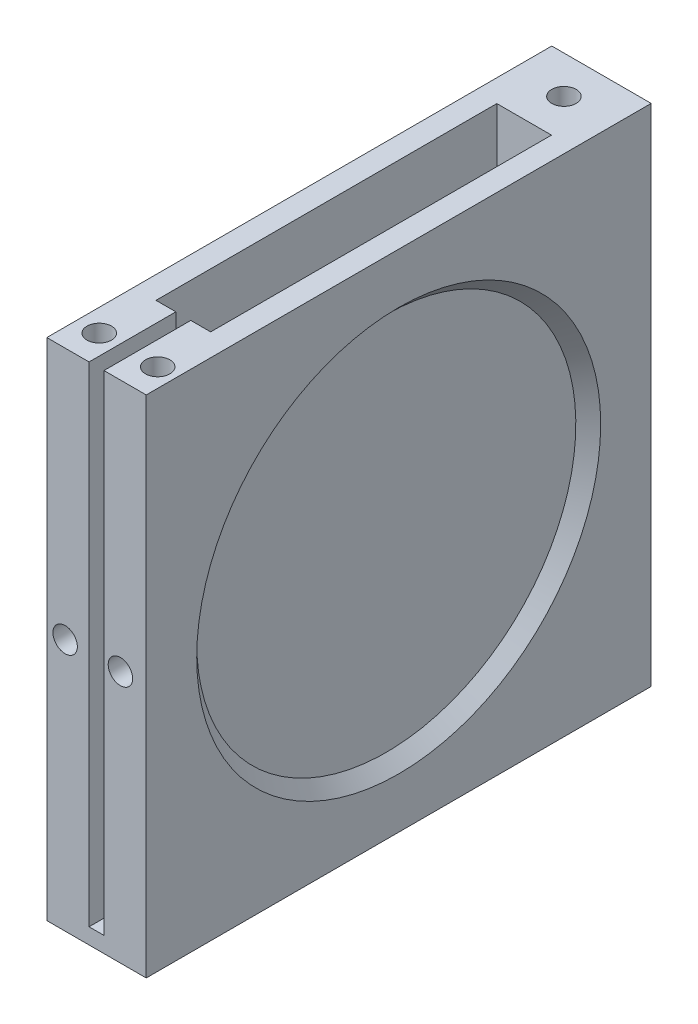
ISO-10303-21;
HEADER;
FILE_DESCRIPTION(('STEP AP214'),'2;1');
FILE_NAME('part.step','',(''),(''),'','','');
FILE_SCHEMA(('AUTOMOTIVE_DESIGN { 1 0 10303 214 1 1 1 1 }'));
ENDSEC;
DATA;
#1=APPLICATION_CONTEXT('core data for automotive mechanical design processes');
#2=APPLICATION_PROTOCOL_DEFINITION('international standard','automotive_design',2000,#1);
#3=PRODUCT_CONTEXT('',#1,'mechanical');
#4=PRODUCT('Part','Part','',(#3));
#5=PRODUCT_RELATED_PRODUCT_CATEGORY('part','',(#4));
#6=PRODUCT_DEFINITION_FORMATION('','',#4);
#7=PRODUCT_DEFINITION_CONTEXT('part definition',#1,'design');
#8=PRODUCT_DEFINITION('design','',#6,#7);
#9=PRODUCT_DEFINITION_SHAPE('','',#8);
#10=(LENGTH_UNIT() NAMED_UNIT(*) SI_UNIT(.MILLI.,.METRE.));
#11=(NAMED_UNIT(*) PLANE_ANGLE_UNIT() SI_UNIT($,.RADIAN.));
#12=(NAMED_UNIT(*) SI_UNIT($,.STERADIAN.) SOLID_ANGLE_UNIT());
#13=UNCERTAINTY_MEASURE_WITH_UNIT(LENGTH_MEASURE(1.E-05),#10,'distance_accuracy_value','');
#14=(GEOMETRIC_REPRESENTATION_CONTEXT(3) GLOBAL_UNCERTAINTY_ASSIGNED_CONTEXT((#13)) GLOBAL_UNIT_ASSIGNED_CONTEXT((#10,
#11,#12)) REPRESENTATION_CONTEXT('',''));
#15=CARTESIAN_POINT('',(0.,0.,0.));
#16=DIRECTION('',(0.,0.,1.));
#17=DIRECTION('',(1.,0.,0.));
#18=AXIS2_PLACEMENT_3D('',#15,#16,#17);
#19=CARTESIAN_POINT('',(0.,0.,-101.6));
#20=DIRECTION('',(0.,0.,1.));
#21=DIRECTION('',(1.,0.,0.));
#22=AXIS2_PLACEMENT_3D('',#19,#20,#21);
#23=PLANE('',#22);
#24=CARTESIAN_POINT('',(-6.10330225330225,0.,-101.6));
#25=DIRECTION('',(0.,0.,-1.));
#26=DIRECTION('',(-1.,0.,0.));
#27=AXIS2_PLACEMENT_3D('',#24,#25,#26);
#28=CIRCLE('',#27,2.45744999999999);
#29=CARTESIAN_POINT('',(-8.56075225330224,0.,-101.6));
#30=VERTEX_POINT('',#29);
#31=EDGE_CURVE('E155',#30,#30,#28,.T.);
#32=ORIENTED_EDGE('',*,*,#31,.F.);
#33=EDGE_LOOP('',(#32));
#34=FACE_BOUND('',#33,.T.);
#35=DIRECTION('',(0.,-1.,0.));
#36=VECTOR('',#35,1.);
#37=CARTESIAN_POINT('',(-10.,50.8,-101.6));
#38=LINE('',#37,#36);
#39=CARTESIAN_POINT('',(-10.,50.8,-101.6));
#40=VERTEX_POINT('',#39);
#41=CARTESIAN_POINT('',(-9.99999999999999,-50.8,-101.6));
#42=VERTEX_POINT('',#41);
#43=EDGE_CURVE('E267',#40,#42,#38,.T.);
#44=ORIENTED_EDGE('',*,*,#43,.F.);
#45=DIRECTION('',(-1.,0.,0.));
#46=VECTOR('',#45,1.);
#47=CARTESIAN_POINT('',(-10.,50.8,-101.6));
#48=LINE('',#47,#46);
#49=CARTESIAN_POINT('',(9.99999999999999,50.8,-101.6));
#50=VERTEX_POINT('',#49);
#51=EDGE_CURVE('E277',#50,#40,#48,.T.);
#52=ORIENTED_EDGE('',*,*,#51,.F.);
#53=DIRECTION('',(0.,1.,0.));
#54=VECTOR('',#53,1.);
#55=CARTESIAN_POINT('',(9.99999999999999,50.8,-101.6));
#56=LINE('',#55,#54);
#57=CARTESIAN_POINT('',(10.,-50.8,-101.6));
#58=VERTEX_POINT('',#57);
#59=EDGE_CURVE('E274',#58,#50,#56,.T.);
#60=ORIENTED_EDGE('',*,*,#59,.F.);
#61=DIRECTION('',(1.,0.,0.));
#62=VECTOR('',#61,1.);
#63=CARTESIAN_POINT('',(-9.99999999999999,-50.8,-101.6));
#64=LINE('',#63,#62);
#65=EDGE_CURVE('E270',#42,#58,#64,.T.);
#66=ORIENTED_EDGE('',*,*,#65,.F.);
#67=EDGE_LOOP('',(#44,#52,#60,#66));
#68=FACE_BOUND('',#67,.T.);
#69=CARTESIAN_POINT('',(0.,0.,-101.6));
#70=DIRECTION('',(0.,0.,-1.));
#71=DIRECTION('',(-1.,0.,0.));
#72=AXIS2_PLACEMENT_3D('',#69,#70,#71);
#73=CIRCLE('',#72,1.5);
#74=CARTESIAN_POINT('',(-1.5,0.,-101.6));
#75=VERTEX_POINT('',#74);
#76=EDGE_CURVE('E177',#75,#75,#73,.T.);
#77=ORIENTED_EDGE('',*,*,#76,.F.);
#78=EDGE_LOOP('',(#77));
#79=FACE_BOUND('',#78,.T.);
#80=CARTESIAN_POINT('',(5.06884424426798,0.,-101.6));
#81=DIRECTION('',(0.,0.,-1.));
#82=DIRECTION('',(-1.,0.,0.));
#83=AXIS2_PLACEMENT_3D('',#80,#81,#82);
#84=CIRCLE('',#83,2.45744999999999);
#85=CARTESIAN_POINT('',(2.61139424426799,0.,-101.6));
#86=VERTEX_POINT('',#85);
#87=EDGE_CURVE('E154',#86,#86,#84,.T.);
#88=ORIENTED_EDGE('',*,*,#87,.F.);
#89=EDGE_LOOP('',(#88));
#90=FACE_BOUND('',#89,.T.);
#91=ADVANCED_FACE('F34',(#34,#68,#79,#90),#23,.F.);
#92=CARTESIAN_POINT('',(-5.5,-47.625,-17.4625));
#93=DIRECTION('',(0.,0.,1.));
#94=DIRECTION('',(1.,0.,0.));
#95=AXIS2_PLACEMENT_3D('',#92,#93,#94);
#96=PLANE('',#95);
#97=DIRECTION('',(1.,0.,0.));
#98=VECTOR('',#97,1.);
#99=CARTESIAN_POINT('',(-5.5,-47.625,-17.4625));
#100=LINE('',#99,#98);
#101=CARTESIAN_POINT('',(1.50000000000001,-47.625,-17.4625));
#102=VERTEX_POINT('',#101);
#103=CARTESIAN_POINT('',(5.5,-47.625,-17.4625));
#104=VERTEX_POINT('',#103);
#105=EDGE_CURVE('E236',#102,#104,#100,.T.);
#106=ORIENTED_EDGE('',*,*,#105,.F.);
#107=DIRECTION('',(0.,-1.,0.));
#108=VECTOR('',#107,1.);
#109=CARTESIAN_POINT('',(1.49999999999999,50.8,-17.4625));
#110=LINE('',#109,#108);
#111=CARTESIAN_POINT('',(1.49999999999999,50.8,-17.4625));
#112=VERTEX_POINT('',#111);
#113=EDGE_CURVE('E51',#112,#102,#110,.T.);
#114=ORIENTED_EDGE('',*,*,#113,.F.);
#115=DIRECTION('',(1.,0.,0.));
#116=VECTOR('',#115,1.);
#117=CARTESIAN_POINT('',(-5.5,50.8,-17.4625));
#118=LINE('',#117,#116);
#119=CARTESIAN_POINT('',(5.5,50.8,-17.4625));
#120=VERTEX_POINT('',#119);
#121=EDGE_CURVE('E249',#112,#120,#118,.T.);
#122=ORIENTED_EDGE('',*,*,#121,.T.);
#123=DIRECTION('',(0.,1.,0.));
#124=VECTOR('',#123,1.);
#125=CARTESIAN_POINT('',(5.5,-47.625,-17.4625));
#126=LINE('',#125,#124);
#127=EDGE_CURVE('E263',#104,#120,#126,.T.);
#128=ORIENTED_EDGE('',*,*,#127,.F.);
#129=EDGE_LOOP('',(#106,#114,#122,#128));
#130=FACE_BOUND('',#129,.T.);
#131=ADVANCED_FACE('F321',(#130),#96,.F.);
#132=CARTESIAN_POINT('',(-10.,50.8,-101.6));
#133=DIRECTION('',(-1.,0.,0.));
#134=DIRECTION('',(0.,-1.,0.));
#135=AXIS2_PLACEMENT_3D('',#132,#133,#134);
#136=PLANE('',#135);
#137=CARTESIAN_POINT('',(-10.,0.,-50.8));
#138=DIRECTION('',(-1.,0.,0.));
#139=DIRECTION('',(0.,-1.,0.));
#140=AXIS2_PLACEMENT_3D('',#137,#138,#139);
#141=CIRCLE('',#140,40.64);
#142=CARTESIAN_POINT('',(-9.99999999999999,-40.64,-50.8));
#143=VERTEX_POINT('',#142);
#144=EDGE_CURVE('E201',#143,#143,#141,.T.);
#145=ORIENTED_EDGE('',*,*,#144,.F.);
#146=EDGE_LOOP('',(#145));
#147=FACE_BOUND('',#146,.T.);
#148=DIRECTION('',(0.,-1.,0.));
#149=VECTOR('',#148,1.);
#150=CARTESIAN_POINT('',(-10.,50.8,0.));
#151=LINE('',#150,#149);
#152=CARTESIAN_POINT('',(-10.,50.8,0.));
#153=VERTEX_POINT('',#152);
#154=CARTESIAN_POINT('',(-9.99999999999999,-50.8,0.));
#155=VERTEX_POINT('',#154);
#156=EDGE_CURVE('E260',#153,#155,#151,.T.);
#157=ORIENTED_EDGE('',*,*,#156,.F.);
#158=DIRECTION('',(0.,0.,1.));
#159=VECTOR('',#158,1.);
#160=CARTESIAN_POINT('',(-10.,50.8,-101.6));
#161=LINE('',#160,#159);
#162=EDGE_CURVE('E11',#40,#153,#161,.T.);
#163=ORIENTED_EDGE('',*,*,#162,.F.);
#164=ORIENTED_EDGE('',*,*,#43,.T.);
#165=DIRECTION('',(0.,0.,1.));
#166=VECTOR('',#165,1.);
#167=CARTESIAN_POINT('',(-9.99999999999999,-50.8,-101.6));
#168=LINE('',#167,#166);
#169=EDGE_CURVE('E38',#42,#155,#168,.T.);
#170=ORIENTED_EDGE('',*,*,#169,.T.);
#171=EDGE_LOOP('',(#157,#163,#164,#170));
#172=FACE_BOUND('',#171,.T.);
#173=ADVANCED_FACE('F36',(#147,#172),#136,.T.);
#174=CARTESIAN_POINT('',(-10.,50.8,-101.6));
#175=DIRECTION('',(0.,1.,0.));
#176=DIRECTION('',(0.,0.,1.));
#177=AXIS2_PLACEMENT_3D('',#174,#175,#176);
#178=PLANE('',#177);
#179=CARTESIAN_POINT('',(-5.49438852834783,50.8,-6.04680271226243));
#180=DIRECTION('',(0.,1.,0.));
#181=DIRECTION('',(0.,0.,1.));
#182=AXIS2_PLACEMENT_3D('',#179,#180,#181);
#183=CIRCLE('',#182,2.45744999999999);
#184=CARTESIAN_POINT('',(-5.49438852834783,50.8,-3.58935271226244));
#185=VERTEX_POINT('',#184);
#186=EDGE_CURVE('E183',#185,#185,#183,.T.);
#187=ORIENTED_EDGE('',*,*,#186,.F.);
#188=EDGE_LOOP('',(#187));
#189=FACE_BOUND('',#188,.T.);
#190=CARTESIAN_POINT('',(6.2626561474417,50.8,-6.04680271226243));
#191=DIRECTION('',(0.,1.,0.));
#192=DIRECTION('',(0.,0.,1.));
#193=AXIS2_PLACEMENT_3D('',#190,#191,#192);
#194=CIRCLE('',#193,2.45744999999999);
#195=CARTESIAN_POINT('',(6.2626561474417,50.8,-3.58935271226244));
#196=VERTEX_POINT('',#195);
#197=EDGE_CURVE('E189',#196,#196,#194,.T.);
#198=ORIENTED_EDGE('',*,*,#197,.F.);
#199=EDGE_LOOP('',(#198));
#200=FACE_BOUND('',#199,.T.);
#201=CARTESIAN_POINT('',(0.,50.8,-94.0389562725272));
#202=DIRECTION('',(0.,1.,0.));
#203=DIRECTION('',(0.,0.,1.));
#204=AXIS2_PLACEMENT_3D('',#201,#202,#203);
#205=CIRCLE('',#204,2.45744999999999);
#206=CARTESIAN_POINT('',(0.,50.8,-91.5815062725272));
#207=VERTEX_POINT('',#206);
#208=EDGE_CURVE('E195',#207,#207,#205,.T.);
#209=ORIENTED_EDGE('',*,*,#208,.F.);
#210=EDGE_LOOP('',(#209));
#211=FACE_BOUND('',#210,.T.);
#212=DIRECTION('',(0.,0.,1.));
#213=VECTOR('',#212,1.);
#214=CARTESIAN_POINT('',(1.49999999999999,50.8,-101.601));
#215=LINE('',#214,#213);
#216=CARTESIAN_POINT('',(1.49999999999999,50.8,0.));
#217=VERTEX_POINT('',#216);
#218=EDGE_CURVE('E228',#112,#217,#215,.T.);
#219=ORIENTED_EDGE('',*,*,#218,.T.);
#220=DIRECTION('',(-1.,0.,0.));
#221=VECTOR('',#220,1.);
#222=CARTESIAN_POINT('',(-10.,50.8,0.));
#223=LINE('',#222,#221);
#224=CARTESIAN_POINT('',(9.99999999999999,50.8,0.));
#225=VERTEX_POINT('',#224);
#226=EDGE_CURVE('E271',#225,#217,#223,.T.);
#227=ORIENTED_EDGE('',*,*,#226,.F.);
#228=DIRECTION('',(0.,0.,1.));
#229=VECTOR('',#228,1.);
#230=CARTESIAN_POINT('',(9.99999999999999,50.8,-101.6));
#231=LINE('',#230,#229);
#232=EDGE_CURVE('E43',#50,#225,#231,.T.);
#233=ORIENTED_EDGE('',*,*,#232,.F.);
#234=ORIENTED_EDGE('',*,*,#51,.T.);
#235=ORIENTED_EDGE('',*,*,#162,.T.);
#236=CARTESIAN_POINT('',(-1.50000000000001,50.8,0.));
#237=VERTEX_POINT('',#236);
#238=EDGE_CURVE('E288',#237,#153,#223,.T.);
#239=ORIENTED_EDGE('',*,*,#238,.F.);
#240=DIRECTION('',(0.,0.,1.));
#241=VECTOR('',#240,1.);
#242=CARTESIAN_POINT('',(-1.50000000000001,50.8,-101.601));
#243=LINE('',#242,#241);
#244=CARTESIAN_POINT('',(-1.50000000000001,50.8,-17.4625));
#245=VERTEX_POINT('',#244);
#246=EDGE_CURVE('E225',#245,#237,#243,.T.);
#247=ORIENTED_EDGE('',*,*,#246,.F.);
#248=CARTESIAN_POINT('',(-5.5,50.8,-17.4625));
#249=VERTEX_POINT('',#248);
#250=EDGE_CURVE('E250',#249,#245,#118,.T.);
#251=ORIENTED_EDGE('',*,*,#250,.F.);
#252=DIRECTION('',(0.,0.,1.));
#253=VECTOR('',#252,1.);
#254=CARTESIAN_POINT('',(-5.50000000000001,50.8,-86.0425));
#255=LINE('',#254,#253);
#256=CARTESIAN_POINT('',(-5.50000000000001,50.8,-86.0425));
#257=VERTEX_POINT('',#256);
#258=EDGE_CURVE('E59',#257,#249,#255,.T.);
#259=ORIENTED_EDGE('',*,*,#258,.F.);
#260=DIRECTION('',(-1.,0.,0.));
#261=VECTOR('',#260,1.);
#262=CARTESIAN_POINT('',(-5.50000000000001,50.8,-86.0425));
#263=LINE('',#262,#261);
#264=CARTESIAN_POINT('',(5.49999999999999,50.8,-86.0425));
#265=VERTEX_POINT('',#264);
#266=EDGE_CURVE('E237',#265,#257,#263,.T.);
#267=ORIENTED_EDGE('',*,*,#266,.F.);
#268=DIRECTION('',(0.,0.,-1.));
#269=VECTOR('',#268,1.);
#270=CARTESIAN_POINT('',(5.49999999999999,50.8,-86.0425));
#271=LINE('',#270,#269);
#272=EDGE_CURVE('E253',#120,#265,#271,.T.);
#273=ORIENTED_EDGE('',*,*,#272,.F.);
#274=ORIENTED_EDGE('',*,*,#121,.F.);
#275=EDGE_LOOP('',(#219,#227,#233,#234,#235,#239,#247,#251,#259,#267,#273,#274));
#276=FACE_BOUND('',#275,.T.);
#277=ADVANCED_FACE('F308',(#189,#200,#211,#276),#178,.T.);
#278=CARTESIAN_POINT('',(9.99999999999999,50.8,-101.6));
#279=DIRECTION('',(1.,0.,0.));
#280=DIRECTION('',(0.,1.,0.));
#281=AXIS2_PLACEMENT_3D('',#278,#279,#280);
#282=PLANE('',#281);
#283=CARTESIAN_POINT('',(10.,0.,-50.8));
#284=DIRECTION('',(1.,0.,0.));
#285=DIRECTION('',(0.,1.,0.));
#286=AXIS2_PLACEMENT_3D('',#283,#284,#285);
#287=CIRCLE('',#286,40.64);
#288=CARTESIAN_POINT('',(9.99999999999999,40.64,-50.8));
#289=VERTEX_POINT('',#288);
#290=EDGE_CURVE('E207',#289,#289,#287,.T.);
#291=ORIENTED_EDGE('',*,*,#290,.F.);
#292=EDGE_LOOP('',(#291));
#293=FACE_BOUND('',#292,.T.);
#294=DIRECTION('',(0.,1.,0.));
#295=VECTOR('',#294,1.);
#296=CARTESIAN_POINT('',(9.99999999999999,50.8,0.));
#297=LINE('',#296,#295);
#298=CARTESIAN_POINT('',(10.,-50.8,0.));
#299=VERTEX_POINT('',#298);
#300=EDGE_CURVE('E285',#299,#225,#297,.T.);
#301=ORIENTED_EDGE('',*,*,#300,.F.);
#302=DIRECTION('',(0.,0.,1.));
#303=VECTOR('',#302,1.);
#304=CARTESIAN_POINT('',(10.,-50.8,-101.6));
#305=LINE('',#304,#303);
#306=EDGE_CURVE('E291',#58,#299,#305,.T.);
#307=ORIENTED_EDGE('',*,*,#306,.F.);
#308=ORIENTED_EDGE('',*,*,#59,.T.);
#309=ORIENTED_EDGE('',*,*,#232,.T.);
#310=EDGE_LOOP('',(#301,#307,#308,#309));
#311=FACE_BOUND('',#310,.T.);
#312=ADVANCED_FACE('F314',(#293,#311),#282,.T.);
#313=CARTESIAN_POINT('',(-9.99999999999999,-50.8,-101.6));
#314=DIRECTION('',(0.,-1.,0.));
#315=DIRECTION('',(0.,0.,-1.));
#316=AXIS2_PLACEMENT_3D('',#313,#314,#315);
#317=PLANE('',#316);
#318=DIRECTION('',(1.,0.,0.));
#319=VECTOR('',#318,1.);
#320=CARTESIAN_POINT('',(-9.99999999999999,-50.8,0.));
#321=LINE('',#320,#319);
#322=EDGE_CURVE('E282',#155,#299,#321,.T.);
#323=ORIENTED_EDGE('',*,*,#322,.F.);
#324=ORIENTED_EDGE('',*,*,#169,.F.);
#325=ORIENTED_EDGE('',*,*,#65,.T.);
#326=ORIENTED_EDGE('',*,*,#306,.T.);
#327=EDGE_LOOP('',(#323,#324,#325,#326));
#328=FACE_BOUND('',#327,.T.);
#329=ADVANCED_FACE('F299',(#328),#317,.T.);
#330=CARTESIAN_POINT('',(0.,0.,0.));
#331=DIRECTION('',(0.,0.,1.));
#332=DIRECTION('',(1.,0.,0.));
#333=AXIS2_PLACEMENT_3D('',#330,#331,#332);
#334=PLANE('',#333);
#335=CARTESIAN_POINT('',(4.80953422007246,0.,0.));
#336=DIRECTION('',(0.,0.,1.));
#337=DIRECTION('',(1.,0.,0.));
#338=AXIS2_PLACEMENT_3D('',#335,#336,#337);
#339=CIRCLE('',#338,2.45745);
#340=CARTESIAN_POINT('',(7.26698422007246,0.,0.));
#341=VERTEX_POINT('',#340);
#342=EDGE_CURVE('E165',#341,#341,#339,.T.);
#343=ORIENTED_EDGE('',*,*,#342,.F.);
#344=EDGE_LOOP('',(#343));
#345=FACE_BOUND('',#344,.T.);
#346=CARTESIAN_POINT('',(-6.31259824089625,0.,0.));
#347=DIRECTION('',(0.,0.,1.));
#348=DIRECTION('',(1.,0.,0.));
#349=AXIS2_PLACEMENT_3D('',#346,#347,#348);
#350=CIRCLE('',#349,2.45745);
#351=CARTESIAN_POINT('',(-3.85514824089625,0.,0.));
#352=VERTEX_POINT('',#351);
#353=EDGE_CURVE('E171',#352,#352,#350,.T.);
#354=ORIENTED_EDGE('',*,*,#353,.F.);
#355=EDGE_LOOP('',(#354));
#356=FACE_BOUND('',#355,.T.);
#357=DIRECTION('',(0.,1.,0.));
#358=VECTOR('',#357,1.);
#359=CARTESIAN_POINT('',(1.49999999999999,50.8,0.));
#360=LINE('',#359,#358);
#361=CARTESIAN_POINT('',(1.50000000000001,-47.625,0.));
#362=VERTEX_POINT('',#361);
#363=EDGE_CURVE('E214',#362,#217,#360,.T.);
#364=ORIENTED_EDGE('',*,*,#363,.F.);
#365=DIRECTION('',(1.,0.,0.));
#366=VECTOR('',#365,1.);
#367=CARTESIAN_POINT('',(-1.49999999999999,-47.625,0.));
#368=LINE('',#367,#366);
#369=CARTESIAN_POINT('',(-1.49999999999999,-47.625,0.));
#370=VERTEX_POINT('',#369);
#371=EDGE_CURVE('E217',#370,#362,#368,.T.);
#372=ORIENTED_EDGE('',*,*,#371,.F.);
#373=DIRECTION('',(0.,-1.,0.));
#374=VECTOR('',#373,1.);
#375=CARTESIAN_POINT('',(-1.50000000000001,50.8,0.));
#376=LINE('',#375,#374);
#377=EDGE_CURVE('E220',#237,#370,#376,.T.);
#378=ORIENTED_EDGE('',*,*,#377,.F.);
#379=ORIENTED_EDGE('',*,*,#238,.T.);
#380=ORIENTED_EDGE('',*,*,#156,.T.);
#381=ORIENTED_EDGE('',*,*,#322,.T.);
#382=ORIENTED_EDGE('',*,*,#300,.T.);
#383=ORIENTED_EDGE('',*,*,#226,.T.);
#384=EDGE_LOOP('',(#364,#372,#378,#379,#380,#381,#382,#383));
#385=FACE_BOUND('',#384,.T.);
#386=ADVANCED_FACE('F302',(#345,#356,#385),#334,.T.);
#387=CARTESIAN_POINT('',(-5.50000000000001,-47.625,-86.0425));
#388=DIRECTION('',(-1.,0.,0.));
#389=DIRECTION('',(0.,0.,1.));
#390=AXIS2_PLACEMENT_3D('',#387,#388,#389);
#391=PLANE('',#390);
#392=ORIENTED_EDGE('',*,*,#258,.T.);
#393=DIRECTION('',(0.,1.,0.));
#394=VECTOR('',#393,1.);
#395=CARTESIAN_POINT('',(-5.5,-47.625,-17.4625));
#396=LINE('',#395,#394);
#397=CARTESIAN_POINT('',(-5.5,-47.625,-17.4625));
#398=VERTEX_POINT('',#397);
#399=EDGE_CURVE('E247',#398,#249,#396,.T.);
#400=ORIENTED_EDGE('',*,*,#399,.F.);
#401=DIRECTION('',(0.,0.,1.));
#402=VECTOR('',#401,1.);
#403=CARTESIAN_POINT('',(-5.50000000000001,-47.625,-86.0425));
#404=LINE('',#403,#402);
#405=CARTESIAN_POINT('',(-5.50000000000001,-47.625,-86.0425));
#406=VERTEX_POINT('',#405);
#407=EDGE_CURVE('E233',#406,#398,#404,.T.);
#408=ORIENTED_EDGE('',*,*,#407,.F.);
#409=DIRECTION('',(0.,1.,0.));
#410=VECTOR('',#409,1.);
#411=CARTESIAN_POINT('',(-5.50000000000001,-47.625,-86.0425));
#412=LINE('',#411,#410);
#413=EDGE_CURVE('E258',#406,#257,#412,.T.);
#414=ORIENTED_EDGE('',*,*,#413,.T.);
#415=EDGE_LOOP('',(#392,#400,#408,#414));
#416=FACE_BOUND('',#415,.T.);
#417=ADVANCED_FACE('F335',(#416),#391,.F.);
#418=CARTESIAN_POINT('',(-5.50000000000001,-47.625,-86.0425));
#419=DIRECTION('',(0.,0.,-1.));
#420=DIRECTION('',(-1.,0.,0.));
#421=AXIS2_PLACEMENT_3D('',#418,#419,#420);
#422=PLANE('',#421);
#423=CARTESIAN_POINT('',(0.,0.,-86.0425));
#424=DIRECTION('',(0.,0.,-1.));
#425=DIRECTION('',(-1.,0.,0.));
#426=AXIS2_PLACEMENT_3D('',#423,#424,#425);
#427=CIRCLE('',#426,1.5);
#428=CARTESIAN_POINT('',(-1.5,0.,-86.0425));
#429=VERTEX_POINT('',#428);
#430=EDGE_CURVE('E180',#429,#429,#427,.F.);
#431=ORIENTED_EDGE('',*,*,#430,.F.);
#432=EDGE_LOOP('',(#431));
#433=FACE_BOUND('',#432,.T.);
#434=ORIENTED_EDGE('',*,*,#266,.T.);
#435=ORIENTED_EDGE('',*,*,#413,.F.);
#436=DIRECTION('',(-1.,0.,0.));
#437=VECTOR('',#436,1.);
#438=CARTESIAN_POINT('',(-5.50000000000001,-47.625,-86.0425));
#439=LINE('',#438,#437);
#440=CARTESIAN_POINT('',(5.49999999999999,-47.625,-86.0425));
#441=VERTEX_POINT('',#440);
#442=EDGE_CURVE('E244',#441,#406,#439,.T.);
#443=ORIENTED_EDGE('',*,*,#442,.F.);
#444=DIRECTION('',(0.,1.,0.));
#445=VECTOR('',#444,1.);
#446=CARTESIAN_POINT('',(5.49999999999999,-47.625,-86.0425));
#447=LINE('',#446,#445);
#448=EDGE_CURVE('E261',#441,#265,#447,.T.);
#449=ORIENTED_EDGE('',*,*,#448,.T.);
#450=EDGE_LOOP('',(#434,#435,#443,#449));
#451=FACE_BOUND('',#450,.T.);
#452=ADVANCED_FACE('F337',(#433,#451),#422,.F.);
#453=CARTESIAN_POINT('',(5.49999999999999,-47.625,-86.0425));
#454=DIRECTION('',(1.,0.,0.));
#455=DIRECTION('',(0.,0.,-1.));
#456=AXIS2_PLACEMENT_3D('',#453,#454,#455);
#457=PLANE('',#456);
#458=ORIENTED_EDGE('',*,*,#272,.T.);
#459=ORIENTED_EDGE('',*,*,#448,.F.);
#460=DIRECTION('',(0.,0.,-1.));
#461=VECTOR('',#460,1.);
#462=CARTESIAN_POINT('',(5.49999999999999,-47.625,-86.0425));
#463=LINE('',#462,#461);
#464=EDGE_CURVE('E241',#104,#441,#463,.T.);
#465=ORIENTED_EDGE('',*,*,#464,.F.);
#466=ORIENTED_EDGE('',*,*,#127,.T.);
#467=EDGE_LOOP('',(#458,#459,#465,#466));
#468=FACE_BOUND('',#467,.T.);
#469=ADVANCED_FACE('F340',(#468),#457,.F.);
#470=ORIENTED_EDGE('',*,*,#250,.T.);
#471=DIRECTION('',(0.,1.,0.));
#472=VECTOR('',#471,1.);
#473=CARTESIAN_POINT('',(-1.50000000000001,50.8,-17.4625));
#474=LINE('',#473,#472);
#475=CARTESIAN_POINT('',(-1.49999999999999,-47.625,-17.4625));
#476=VERTEX_POINT('',#475);
#477=EDGE_CURVE('E213',#476,#245,#474,.T.);
#478=ORIENTED_EDGE('',*,*,#477,.F.);
#479=EDGE_CURVE('E238',#398,#476,#100,.T.);
#480=ORIENTED_EDGE('',*,*,#479,.F.);
#481=ORIENTED_EDGE('',*,*,#399,.T.);
#482=EDGE_LOOP('',(#470,#478,#480,#481));
#483=FACE_BOUND('',#482,.T.);
#484=ADVANCED_FACE('F333',(#483),#96,.F.);
#485=CARTESIAN_POINT('',(0.,-47.625,0.));
#486=DIRECTION('',(0.,1.,0.));
#487=DIRECTION('',(0.,0.,1.));
#488=AXIS2_PLACEMENT_3D('',#485,#486,#487);
#489=PLANE('',#488);
#490=ORIENTED_EDGE('',*,*,#407,.T.);
#491=ORIENTED_EDGE('',*,*,#479,.T.);
#492=DIRECTION('',(0.,0.,1.));
#493=VECTOR('',#492,1.);
#494=CARTESIAN_POINT('',(-1.49999999999999,-47.625,-101.601));
#495=LINE('',#494,#493);
#496=EDGE_CURVE('E227',#476,#370,#495,.T.);
#497=ORIENTED_EDGE('',*,*,#496,.T.);
#498=ORIENTED_EDGE('',*,*,#371,.T.);
#499=DIRECTION('',(0.,0.,1.));
#500=VECTOR('',#499,1.);
#501=CARTESIAN_POINT('',(1.50000000000001,-47.625,-101.601));
#502=LINE('',#501,#500);
#503=EDGE_CURVE('E216',#102,#362,#502,.T.);
#504=ORIENTED_EDGE('',*,*,#503,.F.);
#505=ORIENTED_EDGE('',*,*,#105,.T.);
#506=ORIENTED_EDGE('',*,*,#464,.T.);
#507=ORIENTED_EDGE('',*,*,#442,.T.);
#508=EDGE_LOOP('',(#490,#491,#497,#498,#504,#505,#506,#507));
#509=FACE_BOUND('',#508,.T.);
#510=ADVANCED_FACE('F325',(#509),#489,.T.);
#511=CARTESIAN_POINT('',(1.49999999999999,50.8,-101.601));
#512=DIRECTION('',(1.,0.,0.));
#513=DIRECTION('',(0.,1.,0.));
#514=AXIS2_PLACEMENT_3D('',#511,#512,#513);
#515=PLANE('',#514);
#516=ORIENTED_EDGE('',*,*,#113,.T.);
#517=ORIENTED_EDGE('',*,*,#503,.T.);
#518=ORIENTED_EDGE('',*,*,#363,.T.);
#519=ORIENTED_EDGE('',*,*,#218,.F.);
#520=EDGE_LOOP('',(#516,#517,#518,#519));
#521=FACE_BOUND('',#520,.T.);
#522=ADVANCED_FACE('F318',(#521),#515,.F.);
#523=CARTESIAN_POINT('',(-1.50000000000001,50.8,-101.601));
#524=DIRECTION('',(-1.,0.,0.));
#525=DIRECTION('',(0.,-1.,0.));
#526=AXIS2_PLACEMENT_3D('',#523,#524,#525);
#527=PLANE('',#526);
#528=ORIENTED_EDGE('',*,*,#477,.T.);
#529=ORIENTED_EDGE('',*,*,#246,.T.);
#530=ORIENTED_EDGE('',*,*,#377,.T.);
#531=ORIENTED_EDGE('',*,*,#496,.F.);
#532=EDGE_LOOP('',(#528,#529,#530,#531));
#533=FACE_BOUND('',#532,.T.);
#534=ADVANCED_FACE('F330',(#533),#527,.F.);
#535=CARTESIAN_POINT('',(10.,0.,-50.8));
#536=DIRECTION('',(1.,0.,0.));
#537=DIRECTION('',(0.,1.,0.));
#538=AXIS2_PLACEMENT_3D('',#535,#536,#537);
#539=CONICAL_SURFACE('',#538,40.64,0.78539816339745);
#540=CARTESIAN_POINT('',(7.5,0.,-50.8));
#541=DIRECTION('',(1.,0.,0.));
#542=DIRECTION('',(0.,1.,0.));
#543=AXIS2_PLACEMENT_3D('',#540,#541,#542);
#544=CIRCLE('',#543,38.14);
#545=CARTESIAN_POINT('',(7.5,38.14,-50.8));
#546=VERTEX_POINT('',#545);
#547=EDGE_CURVE('E210',#546,#546,#544,.T.);
#548=ORIENTED_EDGE('',*,*,#547,.F.);
#549=EDGE_LOOP('',(#548));
#550=FACE_BOUND('',#549,.T.);
#551=ORIENTED_EDGE('',*,*,#290,.T.);
#552=EDGE_LOOP('',(#551));
#553=FACE_BOUND('',#552,.T.);
#554=ADVANCED_FACE('F520',(#550,#553),#539,.F.);
#555=CARTESIAN_POINT('',(7.5,0.,-50.8));
#556=DIRECTION('',(1.,0.,0.));
#557=DIRECTION('',(0.,1.,0.));
#558=AXIS2_PLACEMENT_3D('',#555,#556,#557);
#559=PLANE('',#558);
#560=ORIENTED_EDGE('',*,*,#547,.T.);
#561=EDGE_LOOP('',(#560));
#562=FACE_BOUND('',#561,.T.);
#563=ADVANCED_FACE('F516',(#562),#559,.T.);
#564=CARTESIAN_POINT('',(-10.,0.,-50.8));
#565=DIRECTION('',(-1.,0.,0.));
#566=DIRECTION('',(0.,-1.,0.));
#567=AXIS2_PLACEMENT_3D('',#564,#565,#566);
#568=CONICAL_SURFACE('',#567,40.64,0.78539816339745);
#569=CARTESIAN_POINT('',(-7.5,0.,-50.8));
#570=DIRECTION('',(-1.,0.,0.));
#571=DIRECTION('',(0.,-1.,0.));
#572=AXIS2_PLACEMENT_3D('',#569,#570,#571);
#573=CIRCLE('',#572,38.14);
#574=CARTESIAN_POINT('',(-7.5,-38.14,-50.8));
#575=VERTEX_POINT('',#574);
#576=EDGE_CURVE('E204',#575,#575,#573,.T.);
#577=ORIENTED_EDGE('',*,*,#576,.F.);
#578=EDGE_LOOP('',(#577));
#579=FACE_BOUND('',#578,.T.);
#580=ORIENTED_EDGE('',*,*,#144,.T.);
#581=EDGE_LOOP('',(#580));
#582=FACE_BOUND('',#581,.T.);
#583=ADVANCED_FACE('F512',(#579,#582),#568,.F.);
#584=CARTESIAN_POINT('',(-7.5,0.,-50.8));
#585=DIRECTION('',(-1.,0.,0.));
#586=DIRECTION('',(0.,-1.,0.));
#587=AXIS2_PLACEMENT_3D('',#584,#585,#586);
#588=PLANE('',#587);
#589=ORIENTED_EDGE('',*,*,#576,.T.);
#590=EDGE_LOOP('',(#589));
#591=FACE_BOUND('',#590,.T.);
#592=ADVANCED_FACE('F508',(#591),#588,.T.);
#593=CARTESIAN_POINT('',(0.,43.18,-94.0389562725272));
#594=DIRECTION('',(0.,1.,0.));
#595=DIRECTION('',(0.,0.,1.));
#596=AXIS2_PLACEMENT_3D('',#593,#594,#595);
#597=CONICAL_SURFACE('',#596,2.45744999999999,1.02974425867665);
#598=CARTESIAN_POINT('',(0.,41.7034150717707,-94.0389562725272));
#599=VERTEX_POINT('',#598);
#600=VERTEX_LOOP('',#599);
#601=FACE_BOUND('',#600,.T.);
#602=CARTESIAN_POINT('',(0.,43.18,-94.0389562725272));
#603=DIRECTION('',(0.,1.,0.));
#604=DIRECTION('',(0.,0.,1.));
#605=AXIS2_PLACEMENT_3D('',#602,#603,#604);
#606=CIRCLE('',#605,2.45744999999999);
#607=CARTESIAN_POINT('',(0.,43.18,-91.5815062725272));
#608=VERTEX_POINT('',#607);
#609=EDGE_CURVE('E198',#608,#608,#606,.T.);
#610=ORIENTED_EDGE('',*,*,#609,.T.);
#611=EDGE_LOOP('',(#610));
#612=FACE_BOUND('',#611,.T.);
#613=ADVANCED_FACE('F504',(#601,#612),#597,.F.);
#614=CARTESIAN_POINT('',(0.,50.8,-94.0389562725272));
#615=DIRECTION('',(0.,1.,0.));
#616=DIRECTION('',(0.,0.,1.));
#617=AXIS2_PLACEMENT_3D('',#614,#615,#616);
#618=CYLINDRICAL_SURFACE('',#617,2.45744999999999);
#619=ORIENTED_EDGE('',*,*,#609,.F.);
#620=EDGE_LOOP('',(#619));
#621=FACE_BOUND('',#620,.T.);
#622=ORIENTED_EDGE('',*,*,#208,.T.);
#623=EDGE_LOOP('',(#622));
#624=FACE_BOUND('',#623,.T.);
#625=ADVANCED_FACE('F500',(#621,#624),#618,.F.);
#626=CARTESIAN_POINT('',(6.2626561474417,43.18,-6.04680271226243));
#627=DIRECTION('',(0.,1.,0.));
#628=DIRECTION('',(0.,0.,1.));
#629=AXIS2_PLACEMENT_3D('',#626,#627,#628);
#630=CONICAL_SURFACE('',#629,2.45744999999999,1.02974425867665);
#631=CARTESIAN_POINT('',(6.2626561474417,41.7034150717707,-6.04680271226243));
#632=VERTEX_POINT('',#631);
#633=VERTEX_LOOP('',#632);
#634=FACE_BOUND('',#633,.T.);
#635=CARTESIAN_POINT('',(6.2626561474417,43.18,-6.04680271226243));
#636=DIRECTION('',(0.,1.,0.));
#637=DIRECTION('',(0.,0.,1.));
#638=AXIS2_PLACEMENT_3D('',#635,#636,#637);
#639=CIRCLE('',#638,2.45744999999999);
#640=CARTESIAN_POINT('',(6.2626561474417,43.18,-3.58935271226245));
#641=VERTEX_POINT('',#640);
#642=EDGE_CURVE('E192',#641,#641,#639,.T.);
#643=ORIENTED_EDGE('',*,*,#642,.T.);
#644=EDGE_LOOP('',(#643));
#645=FACE_BOUND('',#644,.T.);
#646=ADVANCED_FACE('F496',(#634,#645),#630,.F.);
#647=CARTESIAN_POINT('',(6.2626561474417,50.8,-6.04680271226243));
#648=DIRECTION('',(0.,1.,0.));
#649=DIRECTION('',(0.,0.,1.));
#650=AXIS2_PLACEMENT_3D('',#647,#648,#649);
#651=CYLINDRICAL_SURFACE('',#650,2.45744999999999);
#652=ORIENTED_EDGE('',*,*,#642,.F.);
#653=EDGE_LOOP('',(#652));
#654=FACE_BOUND('',#653,.T.);
#655=ORIENTED_EDGE('',*,*,#197,.T.);
#656=EDGE_LOOP('',(#655));
#657=FACE_BOUND('',#656,.T.);
#658=ADVANCED_FACE('F492',(#654,#657),#651,.F.);
#659=CARTESIAN_POINT('',(-5.49438852834783,43.18,-6.04680271226243));
#660=DIRECTION('',(0.,1.,0.));
#661=DIRECTION('',(0.,0.,1.));
#662=AXIS2_PLACEMENT_3D('',#659,#660,#661);
#663=CONICAL_SURFACE('',#662,2.45744999999999,1.02974425867665);
#664=CARTESIAN_POINT('',(-5.49438852834783,41.7034150717707,-6.04680271226243));
#665=VERTEX_POINT('',#664);
#666=VERTEX_LOOP('',#665);
#667=FACE_BOUND('',#666,.T.);
#668=CARTESIAN_POINT('',(-5.49438852834783,43.18,-6.04680271226243));
#669=DIRECTION('',(0.,1.,0.));
#670=DIRECTION('',(0.,0.,1.));
#671=AXIS2_PLACEMENT_3D('',#668,#669,#670);
#672=CIRCLE('',#671,2.45744999999999);
#673=CARTESIAN_POINT('',(-5.49438852834783,43.18,-3.58935271226245));
#674=VERTEX_POINT('',#673);
#675=EDGE_CURVE('E186',#674,#674,#672,.T.);
#676=ORIENTED_EDGE('',*,*,#675,.T.);
#677=EDGE_LOOP('',(#676));
#678=FACE_BOUND('',#677,.T.);
#679=ADVANCED_FACE('F488',(#667,#678),#663,.F.);
#680=CARTESIAN_POINT('',(-5.49438852834783,50.8,-6.04680271226243));
#681=DIRECTION('',(0.,1.,0.));
#682=DIRECTION('',(0.,0.,1.));
#683=AXIS2_PLACEMENT_3D('',#680,#681,#682);
#684=CYLINDRICAL_SURFACE('',#683,2.45744999999999);
#685=ORIENTED_EDGE('',*,*,#675,.F.);
#686=EDGE_LOOP('',(#685));
#687=FACE_BOUND('',#686,.T.);
#688=ORIENTED_EDGE('',*,*,#186,.T.);
#689=EDGE_LOOP('',(#688));
#690=FACE_BOUND('',#689,.T.);
#691=ADVANCED_FACE('F397',(#687,#690),#684,.F.);
#692=CARTESIAN_POINT('',(0.,0.,0.001000000000001));
#693=DIRECTION('',(0.,0.,-1.));
#694=DIRECTION('',(-1.,0.,0.));
#695=AXIS2_PLACEMENT_3D('',#692,#693,#694);
#696=CYLINDRICAL_SURFACE('',#695,1.5);
#697=ORIENTED_EDGE('',*,*,#76,.T.);
#698=EDGE_LOOP('',(#697));
#699=FACE_BOUND('',#698,.T.);
#700=ORIENTED_EDGE('',*,*,#430,.T.);
#701=EDGE_LOOP('',(#700));
#702=FACE_BOUND('',#701,.T.);
#703=ADVANCED_FACE('F402',(#699,#702),#696,.F.);
#704=CARTESIAN_POINT('',(-6.31259824089625,0.,-6.35));
#705=DIRECTION('',(0.,0.,1.));
#706=DIRECTION('',(1.,0.,0.));
#707=AXIS2_PLACEMENT_3D('',#704,#705,#706);
#708=CONICAL_SURFACE('',#707,2.45745,1.02974425867665);
#709=CARTESIAN_POINT('',(-6.31259824089625,0.,-7.82658492822928));
#710=VERTEX_POINT('',#709);
#711=VERTEX_LOOP('',#710);
#712=FACE_BOUND('',#711,.T.);
#713=CARTESIAN_POINT('',(-6.31259824089625,0.,-6.35));
#714=DIRECTION('',(0.,0.,1.));
#715=DIRECTION('',(1.,0.,0.));
#716=AXIS2_PLACEMENT_3D('',#713,#714,#715);
#717=CIRCLE('',#716,2.45745);
#718=CARTESIAN_POINT('',(-3.85514824089625,0.,-6.35));
#719=VERTEX_POINT('',#718);
#720=EDGE_CURVE('E174',#719,#719,#717,.T.);
#721=ORIENTED_EDGE('',*,*,#720,.T.);
#722=EDGE_LOOP('',(#721));
#723=FACE_BOUND('',#722,.T.);
#724=ADVANCED_FACE('F406',(#712,#723),#708,.F.);
#725=CARTESIAN_POINT('',(-6.31259824089625,0.,0.));
#726=DIRECTION('',(0.,0.,1.));
#727=DIRECTION('',(1.,0.,0.));
#728=AXIS2_PLACEMENT_3D('',#725,#726,#727);
#729=CYLINDRICAL_SURFACE('',#728,2.45745);
#730=ORIENTED_EDGE('',*,*,#720,.F.);
#731=EDGE_LOOP('',(#730));
#732=FACE_BOUND('',#731,.T.);
#733=ORIENTED_EDGE('',*,*,#353,.T.);
#734=EDGE_LOOP('',(#733));
#735=FACE_BOUND('',#734,.T.);
#736=ADVANCED_FACE('F418',(#732,#735),#729,.F.);
#737=CARTESIAN_POINT('',(4.80953422007246,0.,-6.35));
#738=DIRECTION('',(0.,0.,1.));
#739=DIRECTION('',(1.,0.,0.));
#740=AXIS2_PLACEMENT_3D('',#737,#738,#739);
#741=CONICAL_SURFACE('',#740,2.45745,1.02974425867665);
#742=CARTESIAN_POINT('',(4.80953422007246,0.,-7.82658492822928));
#743=VERTEX_POINT('',#742);
#744=VERTEX_LOOP('',#743);
#745=FACE_BOUND('',#744,.T.);
#746=CARTESIAN_POINT('',(4.80953422007246,0.,-6.35));
#747=DIRECTION('',(0.,0.,1.));
#748=DIRECTION('',(1.,0.,0.));
#749=AXIS2_PLACEMENT_3D('',#746,#747,#748);
#750=CIRCLE('',#749,2.45745);
#751=CARTESIAN_POINT('',(7.26698422007246,0.,-6.35));
#752=VERTEX_POINT('',#751);
#753=EDGE_CURVE('E168',#752,#752,#750,.T.);
#754=ORIENTED_EDGE('',*,*,#753,.T.);
#755=EDGE_LOOP('',(#754));
#756=FACE_BOUND('',#755,.T.);
#757=ADVANCED_FACE('F425',(#745,#756),#741,.F.);
#758=CARTESIAN_POINT('',(4.80953422007246,0.,0.));
#759=DIRECTION('',(0.,0.,1.));
#760=DIRECTION('',(1.,0.,0.));
#761=AXIS2_PLACEMENT_3D('',#758,#759,#760);
#762=CYLINDRICAL_SURFACE('',#761,2.45745);
#763=ORIENTED_EDGE('',*,*,#753,.F.);
#764=EDGE_LOOP('',(#763));
#765=FACE_BOUND('',#764,.T.);
#766=ORIENTED_EDGE('',*,*,#342,.T.);
#767=EDGE_LOOP('',(#766));
#768=FACE_BOUND('',#767,.T.);
#769=ADVANCED_FACE('F433',(#765,#768),#762,.F.);
#770=CARTESIAN_POINT('',(5.06884424426798,0.,-95.25));
#771=DIRECTION('',(0.,0.,-1.));
#772=DIRECTION('',(-1.,0.,0.));
#773=AXIS2_PLACEMENT_3D('',#770,#771,#772);
#774=CONICAL_SURFACE('',#773,2.45744999999999,1.02974425867665);
#775=CARTESIAN_POINT('',(5.06884424426798,0.,-93.7734150717707));
#776=VERTEX_POINT('',#775);
#777=VERTEX_LOOP('',#776);
#778=FACE_BOUND('',#777,.T.);
#779=CARTESIAN_POINT('',(5.06884424426798,0.,-95.25));
#780=DIRECTION('',(0.,0.,-1.));
#781=DIRECTION('',(-1.,0.,0.));
#782=AXIS2_PLACEMENT_3D('',#779,#780,#781);
#783=CIRCLE('',#782,2.45744999999999);
#784=CARTESIAN_POINT('',(2.611394244268,0.,-95.25));
#785=VERTEX_POINT('',#784);
#786=EDGE_CURVE('E158',#785,#785,#783,.T.);
#787=ORIENTED_EDGE('',*,*,#786,.T.);
#788=EDGE_LOOP('',(#787));
#789=FACE_BOUND('',#788,.T.);
#790=ADVANCED_FACE('F440',(#778,#789),#774,.F.);
#791=CARTESIAN_POINT('',(5.06884424426798,0.,-101.6));
#792=DIRECTION('',(0.,0.,-1.));
#793=DIRECTION('',(-1.,0.,0.));
#794=AXIS2_PLACEMENT_3D('',#791,#792,#793);
#795=CYLINDRICAL_SURFACE('',#794,2.45744999999999);
#796=ORIENTED_EDGE('',*,*,#786,.F.);
#797=EDGE_LOOP('',(#796));
#798=FACE_BOUND('',#797,.T.);
#799=ORIENTED_EDGE('',*,*,#87,.T.);
#800=EDGE_LOOP('',(#799));
#801=FACE_BOUND('',#800,.T.);
#802=ADVANCED_FACE('F148',(#798,#801),#795,.F.);
#803=CARTESIAN_POINT('',(-6.10330225330225,0.,-95.25));
#804=DIRECTION('',(0.,0.,-1.));
#805=DIRECTION('',(-1.,0.,0.));
#806=AXIS2_PLACEMENT_3D('',#803,#804,#805);
#807=CONICAL_SURFACE('',#806,2.45744999999999,1.02974425867665);
#808=CARTESIAN_POINT('',(-6.10330225330225,0.,-93.7734150717707));
#809=VERTEX_POINT('',#808);
#810=VERTEX_LOOP('',#809);
#811=FACE_BOUND('',#810,.T.);
#812=CARTESIAN_POINT('',(-6.10330225330225,0.,-95.25));
#813=DIRECTION('',(0.,0.,-1.));
#814=DIRECTION('',(-1.,0.,0.));
#815=AXIS2_PLACEMENT_3D('',#812,#813,#814);
#816=CIRCLE('',#815,2.45744999999999);
#817=CARTESIAN_POINT('',(-8.56075225330223,0.,-95.25));
#818=VERTEX_POINT('',#817);
#819=EDGE_CURVE('E152',#818,#818,#816,.T.);
#820=ORIENTED_EDGE('',*,*,#819,.T.);
#821=EDGE_LOOP('',(#820));
#822=FACE_BOUND('',#821,.T.);
#823=ADVANCED_FACE('F144',(#811,#822),#807,.F.);
#824=CARTESIAN_POINT('',(-6.10330225330225,0.,-101.6));
#825=DIRECTION('',(0.,0.,-1.));
#826=DIRECTION('',(-1.,0.,0.));
#827=AXIS2_PLACEMENT_3D('',#824,#825,#826);
#828=CYLINDRICAL_SURFACE('',#827,2.45744999999999);
#829=ORIENTED_EDGE('',*,*,#819,.F.);
#830=EDGE_LOOP('',(#829));
#831=FACE_BOUND('',#830,.T.);
#832=ORIENTED_EDGE('',*,*,#31,.T.);
#833=EDGE_LOOP('',(#832));
#834=FACE_BOUND('',#833,.T.);
#835=ADVANCED_FACE('F147',(#831,#834),#828,.F.);
#836=CLOSED_SHELL('',(#91,#131,#173,#277,#312,#329,#386,#417,#452,#469,#484,#510,#522,#534,#554,
#563,#583,#592,#613,#625,#646,#658,#679,#691,#703,#724,#736,#757,#769,#790,#802,#823,#835));
#837=MANIFOLD_SOLID_BREP('B2',#836);
#838=ADVANCED_BREP_SHAPE_REPRESENTATION('',(#18,#837),#14);
#839=SHAPE_DEFINITION_REPRESENTATION(#9,#838);
ENDSEC;
END-ISO-10303-21;
